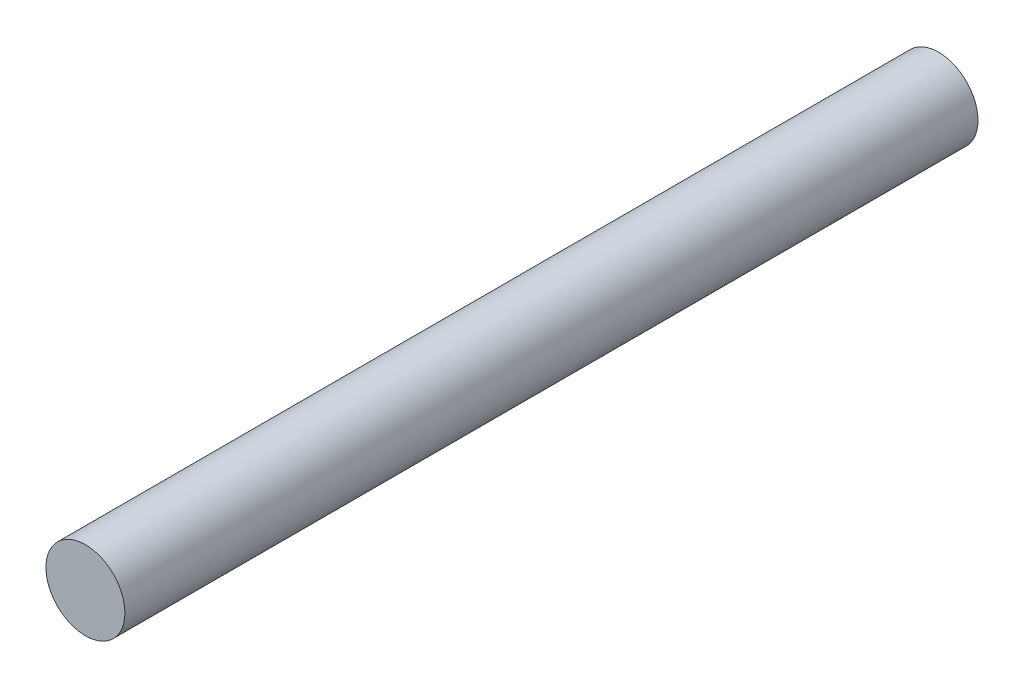
ISO-10303-21;
HEADER;
FILE_DESCRIPTION(('STEP AP214'),'2;1');
FILE_NAME('part.step','',(''),(''),'','','');
FILE_SCHEMA(('AUTOMOTIVE_DESIGN { 1 0 10303 214 1 1 1 1 }'));
ENDSEC;
DATA;
#1=APPLICATION_CONTEXT('core data for automotive mechanical design processes');
#2=APPLICATION_PROTOCOL_DEFINITION('international standard','automotive_design',2000,#1);
#3=PRODUCT_CONTEXT('',#1,'mechanical');
#4=PRODUCT('Part','Part','',(#3));
#5=PRODUCT_RELATED_PRODUCT_CATEGORY('part','',(#4));
#6=PRODUCT_DEFINITION_FORMATION('','',#4);
#7=PRODUCT_DEFINITION_CONTEXT('part definition',#1,'design');
#8=PRODUCT_DEFINITION('design','',#6,#7);
#9=PRODUCT_DEFINITION_SHAPE('','',#8);
#10=(LENGTH_UNIT() NAMED_UNIT(*) SI_UNIT(.MILLI.,.METRE.));
#11=(NAMED_UNIT(*) PLANE_ANGLE_UNIT() SI_UNIT($,.RADIAN.));
#12=(NAMED_UNIT(*) SI_UNIT($,.STERADIAN.) SOLID_ANGLE_UNIT());
#13=UNCERTAINTY_MEASURE_WITH_UNIT(LENGTH_MEASURE(1.E-05),#10,'distance_accuracy_value','');
#14=(GEOMETRIC_REPRESENTATION_CONTEXT(3) GLOBAL_UNCERTAINTY_ASSIGNED_CONTEXT((#13)) GLOBAL_UNIT_ASSIGNED_CONTEXT((#10,
#11,#12)) REPRESENTATION_CONTEXT('',''));
#15=CARTESIAN_POINT('',(0.,0.,0.));
#16=DIRECTION('',(0.,0.,1.));
#17=DIRECTION('',(1.,0.,0.));
#18=AXIS2_PLACEMENT_3D('',#15,#16,#17);
#19=CARTESIAN_POINT('',(0.,0.,54.));
#20=DIRECTION('',(0.,0.,-1.));
#21=DIRECTION('',(-1.,0.,0.));
#22=AXIS2_PLACEMENT_3D('',#19,#20,#21);
#23=CYLINDRICAL_SURFACE('',#22,2.5);
#24=CARTESIAN_POINT('',(0.,0.,54.));
#25=DIRECTION('',(0.,0.,1.));
#26=DIRECTION('',(1.,0.,0.));
#27=AXIS2_PLACEMENT_3D('',#24,#25,#26);
#28=CIRCLE('',#27,2.5);
#29=CARTESIAN_POINT('',(2.5,0.,54.));
#30=VERTEX_POINT('',#29);
#31=EDGE_CURVE('E10',#30,#30,#28,.T.);
#32=ORIENTED_EDGE('',*,*,#31,.F.);
#33=EDGE_LOOP('',(#32));
#34=FACE_BOUND('',#33,.T.);
#35=CARTESIAN_POINT('',(0.,0.,0.));
#36=DIRECTION('',(0.,0.,1.));
#37=DIRECTION('',(1.,0.,0.));
#38=AXIS2_PLACEMENT_3D('',#35,#36,#37);
#39=CIRCLE('',#38,2.5);
#40=CARTESIAN_POINT('',(2.5,0.,0.));
#41=VERTEX_POINT('',#40);
#42=EDGE_CURVE('E33',#41,#41,#39,.T.);
#43=ORIENTED_EDGE('',*,*,#42,.T.);
#44=EDGE_LOOP('',(#43));
#45=FACE_BOUND('',#44,.T.);
#46=ADVANCED_FACE('F30',(#34,#45),#23,.T.);
#47=CARTESIAN_POINT('',(0.,0.,54.));
#48=DIRECTION('',(0.,0.,1.));
#49=DIRECTION('',(1.,0.,0.));
#50=AXIS2_PLACEMENT_3D('',#47,#48,#49);
#51=PLANE('',#50);
#52=ORIENTED_EDGE('',*,*,#31,.T.);
#53=EDGE_LOOP('',(#52));
#54=FACE_BOUND('',#53,.T.);
#55=ADVANCED_FACE('F45',(#54),#51,.T.);
#56=CARTESIAN_POINT('',(0.,0.,0.));
#57=DIRECTION('',(0.,0.,1.));
#58=DIRECTION('',(1.,0.,0.));
#59=AXIS2_PLACEMENT_3D('',#56,#57,#58);
#60=PLANE('',#59);
#61=ORIENTED_EDGE('',*,*,#42,.F.);
#62=EDGE_LOOP('',(#61));
#63=FACE_BOUND('',#62,.T.);
#64=ADVANCED_FACE('F43',(#63),#60,.F.);
#65=CLOSED_SHELL('',(#46,#55,#64));
#66=MANIFOLD_SOLID_BREP('B2',#65);
#67=ADVANCED_BREP_SHAPE_REPRESENTATION('',(#18,#66),#14);
#68=SHAPE_DEFINITION_REPRESENTATION(#9,#67);
ENDSEC;
END-ISO-10303-21;
